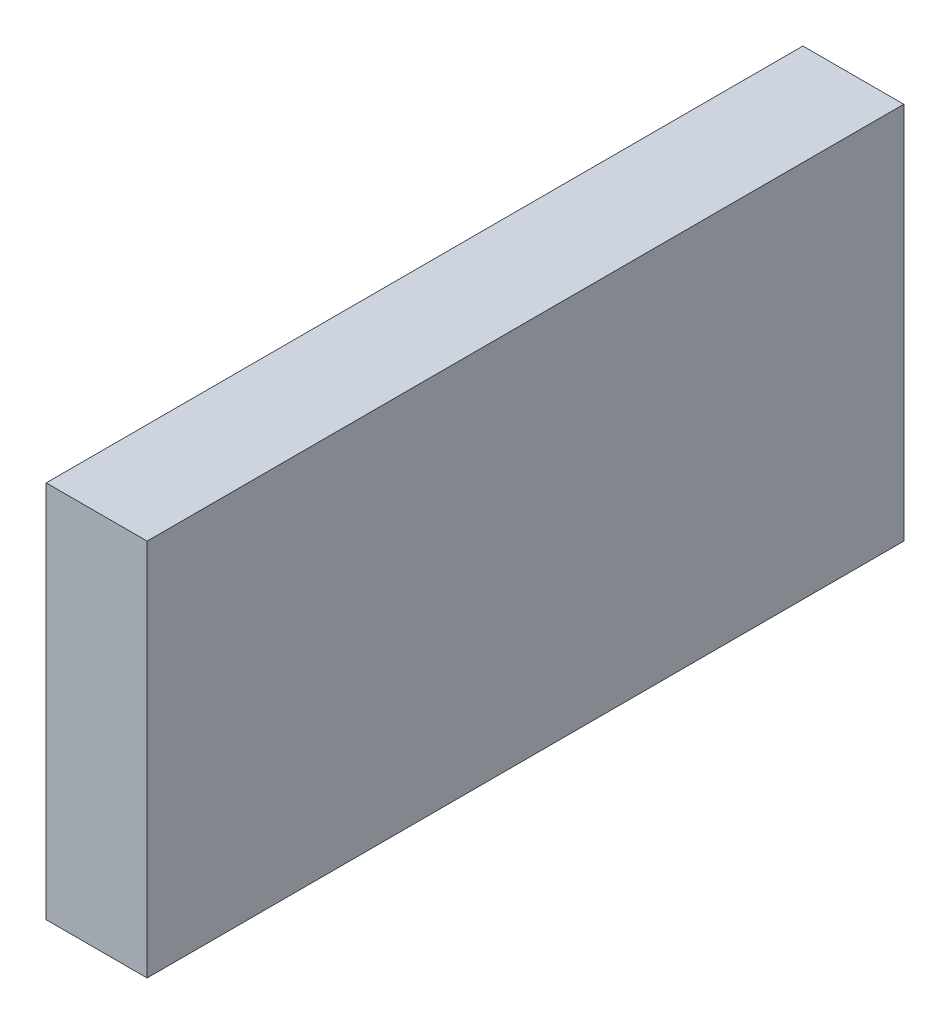
ISO-10303-21;
HEADER;
FILE_DESCRIPTION(('STEP AP214'),'2;1');
FILE_NAME('part.step','',(''),(''),'','','');
FILE_SCHEMA(('AUTOMOTIVE_DESIGN { 1 0 10303 214 1 1 1 1 }'));
ENDSEC;
DATA;
#1=APPLICATION_CONTEXT('core data for automotive mechanical design processes');
#2=APPLICATION_PROTOCOL_DEFINITION('international standard','automotive_design',2000,#1);
#3=PRODUCT_CONTEXT('',#1,'mechanical');
#4=PRODUCT('Part','Part','',(#3));
#5=PRODUCT_RELATED_PRODUCT_CATEGORY('part','',(#4));
#6=PRODUCT_DEFINITION_FORMATION('','',#4);
#7=PRODUCT_DEFINITION_CONTEXT('part definition',#1,'design');
#8=PRODUCT_DEFINITION('design','',#6,#7);
#9=PRODUCT_DEFINITION_SHAPE('','',#8);
#10=(LENGTH_UNIT() NAMED_UNIT(*) SI_UNIT(.MILLI.,.METRE.));
#11=(NAMED_UNIT(*) PLANE_ANGLE_UNIT() SI_UNIT($,.RADIAN.));
#12=(NAMED_UNIT(*) SI_UNIT($,.STERADIAN.) SOLID_ANGLE_UNIT());
#13=UNCERTAINTY_MEASURE_WITH_UNIT(LENGTH_MEASURE(1.E-05),#10,'distance_accuracy_value','');
#14=(GEOMETRIC_REPRESENTATION_CONTEXT(3) GLOBAL_UNCERTAINTY_ASSIGNED_CONTEXT((#13)) GLOBAL_UNIT_ASSIGNED_CONTEXT((#10,
#11,#12)) REPRESENTATION_CONTEXT('',''));
#15=CARTESIAN_POINT('',(0.,0.,0.));
#16=DIRECTION('',(0.,0.,1.));
#17=DIRECTION('',(1.,0.,0.));
#18=AXIS2_PLACEMENT_3D('',#15,#16,#17);
#19=CARTESIAN_POINT('',(2.,7.5,30.));
#20=DIRECTION('',(-1.,0.,0.));
#21=DIRECTION('',(0.,-1.,0.));
#22=AXIS2_PLACEMENT_3D('',#19,#20,#21);
#23=PLANE('',#22);
#24=DIRECTION('',(0.,1.,0.));
#25=VECTOR('',#24,1.);
#26=CARTESIAN_POINT('',(2.,7.5,0.));
#27=LINE('',#26,#25);
#28=CARTESIAN_POINT('',(2.,-7.5,0.));
#29=VERTEX_POINT('',#28);
#30=CARTESIAN_POINT('',(2.,7.5,0.));
#31=VERTEX_POINT('',#30);
#32=EDGE_CURVE('E96',#29,#31,#27,.T.);
#33=ORIENTED_EDGE('',*,*,#32,.T.);
#34=DIRECTION('',(0.,0.,-1.));
#35=VECTOR('',#34,1.);
#36=CARTESIAN_POINT('',(2.,7.5,30.));
#37=LINE('',#36,#35);
#38=CARTESIAN_POINT('',(2.,7.5,30.));
#39=VERTEX_POINT('',#38);
#40=EDGE_CURVE('E11',#39,#31,#37,.T.);
#41=ORIENTED_EDGE('',*,*,#40,.F.);
#42=DIRECTION('',(0.,1.,0.));
#43=VECTOR('',#42,1.);
#44=CARTESIAN_POINT('',(2.,7.5,30.));
#45=LINE('',#44,#43);
#46=CARTESIAN_POINT('',(2.,-7.5,30.));
#47=VERTEX_POINT('',#46);
#48=EDGE_CURVE('E84',#47,#39,#45,.T.);
#49=ORIENTED_EDGE('',*,*,#48,.F.);
#50=DIRECTION('',(0.,0.,-1.));
#51=VECTOR('',#50,1.);
#52=CARTESIAN_POINT('',(2.,-7.5,30.));
#53=LINE('',#52,#51);
#54=EDGE_CURVE('E92',#47,#29,#53,.T.);
#55=ORIENTED_EDGE('',*,*,#54,.T.);
#56=EDGE_LOOP('',(#33,#41,#49,#55));
#57=FACE_BOUND('',#56,.T.);
#58=ADVANCED_FACE('F33',(#57),#23,.F.);
#59=CARTESIAN_POINT('',(-2.,7.5,30.));
#60=DIRECTION('',(0.,-1.,0.));
#61=DIRECTION('',(0.,0.,-1.));
#62=AXIS2_PLACEMENT_3D('',#59,#60,#61);
#63=PLANE('',#62);
#64=DIRECTION('',(-1.,0.,0.));
#65=VECTOR('',#64,1.);
#66=CARTESIAN_POINT('',(-2.,7.5,0.));
#67=LINE('',#66,#65);
#68=CARTESIAN_POINT('',(-2.,7.5,0.));
#69=VERTEX_POINT('',#68);
#70=EDGE_CURVE('E88',#31,#69,#67,.T.);
#71=ORIENTED_EDGE('',*,*,#70,.T.);
#72=DIRECTION('',(0.,0.,-1.));
#73=VECTOR('',#72,1.);
#74=CARTESIAN_POINT('',(-2.,7.5,30.));
#75=LINE('',#74,#73);
#76=CARTESIAN_POINT('',(-2.,7.5,30.));
#77=VERTEX_POINT('',#76);
#78=EDGE_CURVE('E41',#77,#69,#75,.T.);
#79=ORIENTED_EDGE('',*,*,#78,.F.);
#80=DIRECTION('',(-1.,0.,0.));
#81=VECTOR('',#80,1.);
#82=CARTESIAN_POINT('',(-2.,7.5,30.));
#83=LINE('',#82,#81);
#84=EDGE_CURVE('E79',#39,#77,#83,.T.);
#85=ORIENTED_EDGE('',*,*,#84,.F.);
#86=ORIENTED_EDGE('',*,*,#40,.T.);
#87=EDGE_LOOP('',(#71,#79,#85,#86));
#88=FACE_BOUND('',#87,.T.);
#89=ADVANCED_FACE('F87',(#88),#63,.F.);
#90=CARTESIAN_POINT('',(-2.,7.5,30.));
#91=DIRECTION('',(1.,0.,0.));
#92=DIRECTION('',(0.,1.,0.));
#93=AXIS2_PLACEMENT_3D('',#90,#91,#92);
#94=PLANE('',#93);
#95=DIRECTION('',(0.,-1.,0.));
#96=VECTOR('',#95,1.);
#97=CARTESIAN_POINT('',(-2.,7.5,0.));
#98=LINE('',#97,#96);
#99=CARTESIAN_POINT('',(-2.,-7.5,0.));
#100=VERTEX_POINT('',#99);
#101=EDGE_CURVE('E66',#69,#100,#98,.T.);
#102=ORIENTED_EDGE('',*,*,#101,.T.);
#103=DIRECTION('',(0.,0.,-1.));
#104=VECTOR('',#103,1.);
#105=CARTESIAN_POINT('',(-2.,-7.5,30.));
#106=LINE('',#105,#104);
#107=CARTESIAN_POINT('',(-2.,-7.5,30.));
#108=VERTEX_POINT('',#107);
#109=EDGE_CURVE('E89',#108,#100,#106,.T.);
#110=ORIENTED_EDGE('',*,*,#109,.F.);
#111=DIRECTION('',(0.,-1.,0.));
#112=VECTOR('',#111,1.);
#113=CARTESIAN_POINT('',(-2.,7.5,30.));
#114=LINE('',#113,#112);
#115=EDGE_CURVE('E82',#77,#108,#114,.T.);
#116=ORIENTED_EDGE('',*,*,#115,.F.);
#117=ORIENTED_EDGE('',*,*,#78,.T.);
#118=EDGE_LOOP('',(#102,#110,#116,#117));
#119=FACE_BOUND('',#118,.T.);
#120=ADVANCED_FACE('F90',(#119),#94,.F.);
#121=CARTESIAN_POINT('',(-2.,-7.5,30.));
#122=DIRECTION('',(0.,1.,0.));
#123=DIRECTION('',(0.,0.,1.));
#124=AXIS2_PLACEMENT_3D('',#121,#122,#123);
#125=PLANE('',#124);
#126=DIRECTION('',(1.,0.,0.));
#127=VECTOR('',#126,1.);
#128=CARTESIAN_POINT('',(-2.,-7.5,0.));
#129=LINE('',#128,#127);
#130=EDGE_CURVE('E72',#100,#29,#129,.T.);
#131=ORIENTED_EDGE('',*,*,#130,.T.);
#132=ORIENTED_EDGE('',*,*,#54,.F.);
#133=DIRECTION('',(1.,0.,0.));
#134=VECTOR('',#133,1.);
#135=CARTESIAN_POINT('',(-2.,-7.5,30.));
#136=LINE('',#135,#134);
#137=EDGE_CURVE('E49',#108,#47,#136,.T.);
#138=ORIENTED_EDGE('',*,*,#137,.F.);
#139=ORIENTED_EDGE('',*,*,#109,.T.);
#140=EDGE_LOOP('',(#131,#132,#138,#139));
#141=FACE_BOUND('',#140,.T.);
#142=ADVANCED_FACE('F103',(#141),#125,.F.);
#143=CARTESIAN_POINT('',(0.,0.,30.));
#144=DIRECTION('',(0.,0.,1.));
#145=DIRECTION('',(1.,0.,0.));
#146=AXIS2_PLACEMENT_3D('',#143,#144,#145);
#147=PLANE('',#146);
#148=ORIENTED_EDGE('',*,*,#48,.T.);
#149=ORIENTED_EDGE('',*,*,#84,.T.);
#150=ORIENTED_EDGE('',*,*,#115,.T.);
#151=ORIENTED_EDGE('',*,*,#137,.T.);
#152=EDGE_LOOP('',(#148,#149,#150,#151));
#153=FACE_BOUND('',#152,.T.);
#154=ADVANCED_FACE('F80',(#153),#147,.T.);
#155=CARTESIAN_POINT('',(0.,0.,0.));
#156=DIRECTION('',(0.,0.,1.));
#157=DIRECTION('',(1.,0.,0.));
#158=AXIS2_PLACEMENT_3D('',#155,#156,#157);
#159=PLANE('',#158);
#160=ORIENTED_EDGE('',*,*,#32,.F.);
#161=ORIENTED_EDGE('',*,*,#130,.F.);
#162=ORIENTED_EDGE('',*,*,#101,.F.);
#163=ORIENTED_EDGE('',*,*,#70,.F.);
#164=EDGE_LOOP('',(#160,#161,#162,#163));
#165=FACE_BOUND('',#164,.T.);
#166=ADVANCED_FACE('F106',(#165),#159,.F.);
#167=CLOSED_SHELL('',(#58,#89,#120,#142,#154,#166));
#168=MANIFOLD_SOLID_BREP('B2',#167);
#169=ADVANCED_BREP_SHAPE_REPRESENTATION('',(#18,#168),#14);
#170=SHAPE_DEFINITION_REPRESENTATION(#9,#169);
ENDSEC;
END-ISO-10303-21;
